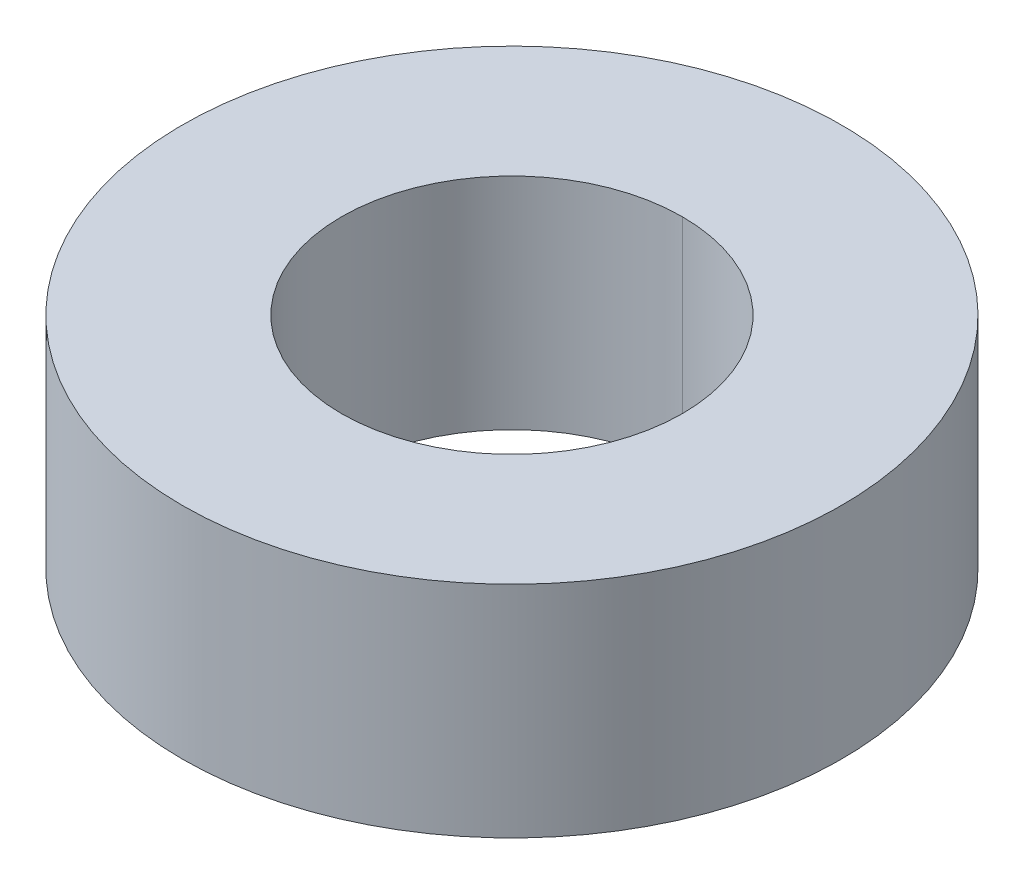
ISO-10303-21;
HEADER;
FILE_DESCRIPTION(('STEP AP214'),'2;1');
FILE_NAME('part.step','',(''),(''),'','','');
FILE_SCHEMA(('AUTOMOTIVE_DESIGN { 1 0 10303 214 1 1 1 1 }'));
ENDSEC;
DATA;
#1=APPLICATION_CONTEXT('core data for automotive mechanical design processes');
#2=APPLICATION_PROTOCOL_DEFINITION('international standard','automotive_design',2000,#1);
#3=PRODUCT_CONTEXT('',#1,'mechanical');
#4=PRODUCT('Part','Part','',(#3));
#5=PRODUCT_RELATED_PRODUCT_CATEGORY('part','',(#4));
#6=PRODUCT_DEFINITION_FORMATION('','',#4);
#7=PRODUCT_DEFINITION_CONTEXT('part definition',#1,'design');
#8=PRODUCT_DEFINITION('design','',#6,#7);
#9=PRODUCT_DEFINITION_SHAPE('','',#8);
#10=(LENGTH_UNIT() NAMED_UNIT(*) SI_UNIT(.MILLI.,.METRE.));
#11=(NAMED_UNIT(*) PLANE_ANGLE_UNIT() SI_UNIT($,.RADIAN.));
#12=(NAMED_UNIT(*) SI_UNIT($,.STERADIAN.) SOLID_ANGLE_UNIT());
#13=UNCERTAINTY_MEASURE_WITH_UNIT(LENGTH_MEASURE(1.E-05),#10,'distance_accuracy_value','');
#14=(GEOMETRIC_REPRESENTATION_CONTEXT(3) GLOBAL_UNCERTAINTY_ASSIGNED_CONTEXT((#13)) GLOBAL_UNIT_ASSIGNED_CONTEXT((#10,
#11,#12)) REPRESENTATION_CONTEXT('',''));
#15=CARTESIAN_POINT('',(0.,0.,0.));
#16=DIRECTION('',(0.,0.,1.));
#17=DIRECTION('',(1.,0.,0.));
#18=AXIS2_PLACEMENT_3D('',#15,#16,#17);
#19=CARTESIAN_POINT('',(0.,1.5875,0.));
#20=DIRECTION('',(0.,1.,0.));
#21=DIRECTION('',(1.,0.,0.));
#22=AXIS2_PLACEMENT_3D('',#19,#20,#21);
#23=PLANE('',#22);
#24=CARTESIAN_POINT('',(0.,1.5875,0.));
#25=DIRECTION('',(0.,1.,0.));
#26=DIRECTION('',(0.,0.,1.));
#27=AXIS2_PLACEMENT_3D('',#24,#25,#26);
#28=CIRCLE('',#27,2.4638);
#29=CARTESIAN_POINT('',(0.,1.5875,-2.4638));
#30=VERTEX_POINT('',#29);
#31=CARTESIAN_POINT('',(0.,1.5875,2.4638));
#32=VERTEX_POINT('',#31);
#33=EDGE_CURVE('E63',#30,#32,#28,.T.);
#34=ORIENTED_EDGE('',*,*,#33,.F.);
#35=CARTESIAN_POINT('',(0.,1.5875,0.));
#36=DIRECTION('',(0.,1.,0.));
#37=DIRECTION('',(0.,0.,1.));
#38=AXIS2_PLACEMENT_3D('',#35,#36,#37);
#39=CIRCLE('',#38,2.4638);
#40=EDGE_CURVE('E83',#32,#30,#39,.T.);
#41=ORIENTED_EDGE('',*,*,#40,.F.);
#42=EDGE_LOOP('',(#34,#41));
#43=FACE_BOUND('',#42,.T.);
#44=CARTESIAN_POINT('',(0.,1.5875,0.));
#45=DIRECTION('',(0.,1.,0.));
#46=DIRECTION('',(0.,0.,1.));
#47=AXIS2_PLACEMENT_3D('',#44,#45,#46);
#48=CIRCLE('',#47,4.7625);
#49=CARTESIAN_POINT('',(0.,1.5875,4.7625));
#50=VERTEX_POINT('',#49);
#51=EDGE_CURVE('E96',#50,#50,#48,.T.);
#52=ORIENTED_EDGE('',*,*,#51,.T.);
#53=EDGE_LOOP('',(#52));
#54=FACE_BOUND('',#53,.T.);
#55=ADVANCED_FACE('F42',(#43,#54),#23,.T.);
#56=CARTESIAN_POINT('',(0.,-1.5875,0.));
#57=DIRECTION('',(0.,1.,0.));
#58=DIRECTION('',(1.,0.,0.));
#59=AXIS2_PLACEMENT_3D('',#56,#57,#58);
#60=PLANE('',#59);
#61=CARTESIAN_POINT('',(0.,-1.5875,0.));
#62=DIRECTION('',(0.,1.,0.));
#63=DIRECTION('',(0.,0.,1.));
#64=AXIS2_PLACEMENT_3D('',#61,#62,#63);
#65=CIRCLE('',#64,2.4638);
#66=CARTESIAN_POINT('',(0.,-1.5875,-2.4638));
#67=VERTEX_POINT('',#66);
#68=CARTESIAN_POINT('',(0.,-1.5875,2.4638));
#69=VERTEX_POINT('',#68);
#70=EDGE_CURVE('E11',#67,#69,#65,.T.);
#71=ORIENTED_EDGE('',*,*,#70,.T.);
#72=CARTESIAN_POINT('',(0.,-1.5875,0.));
#73=DIRECTION('',(0.,1.,0.));
#74=DIRECTION('',(0.,0.,1.));
#75=AXIS2_PLACEMENT_3D('',#72,#73,#74);
#76=CIRCLE('',#75,2.4638);
#77=EDGE_CURVE('E46',#69,#67,#76,.T.);
#78=ORIENTED_EDGE('',*,*,#77,.T.);
#79=EDGE_LOOP('',(#71,#78));
#80=FACE_BOUND('',#79,.T.);
#81=CARTESIAN_POINT('',(0.,-1.5875,0.));
#82=DIRECTION('',(0.,1.,0.));
#83=DIRECTION('',(0.,0.,1.));
#84=AXIS2_PLACEMENT_3D('',#81,#82,#83);
#85=CIRCLE('',#84,4.7625);
#86=CARTESIAN_POINT('',(0.,-1.5875,4.7625));
#87=VERTEX_POINT('',#86);
#88=EDGE_CURVE('E88',#87,#87,#85,.T.);
#89=ORIENTED_EDGE('',*,*,#88,.F.);
#90=EDGE_LOOP('',(#89));
#91=FACE_BOUND('',#90,.T.);
#92=ADVANCED_FACE('F44',(#80,#91),#60,.F.);
#93=CARTESIAN_POINT('',(0.,1.5875,0.));
#94=DIRECTION('',(0.,-1.,0.));
#95=DIRECTION('',(0.,0.,-1.));
#96=AXIS2_PLACEMENT_3D('',#93,#94,#95);
#97=CYLINDRICAL_SURFACE('',#96,2.4638);
#98=DIRECTION('',(0.,-1.,0.));
#99=VECTOR('',#98,1.);
#100=CARTESIAN_POINT('',(0.,1.5875,2.4638));
#101=LINE('',#100,#99);
#102=EDGE_CURVE('E79',#32,#69,#101,.T.);
#103=ORIENTED_EDGE('',*,*,#102,.F.);
#104=ORIENTED_EDGE('',*,*,#40,.T.);
#105=DIRECTION('',(0.,-1.,0.));
#106=VECTOR('',#105,1.);
#107=CARTESIAN_POINT('',(0.,1.5875,-2.4638));
#108=LINE('',#107,#106);
#109=EDGE_CURVE('E81',#30,#67,#108,.T.);
#110=ORIENTED_EDGE('',*,*,#109,.T.);
#111=ORIENTED_EDGE('',*,*,#77,.F.);
#112=EDGE_LOOP('',(#103,#104,#110,#111));
#113=FACE_BOUND('',#112,.T.);
#114=ADVANCED_FACE('F77',(#113),#97,.F.);
#115=CARTESIAN_POINT('',(0.,1.5875,0.));
#116=DIRECTION('',(0.,-1.,0.));
#117=DIRECTION('',(0.,0.,-1.));
#118=AXIS2_PLACEMENT_3D('',#115,#116,#117);
#119=CYLINDRICAL_SURFACE('',#118,2.4638);
#120=ORIENTED_EDGE('',*,*,#33,.T.);
#121=ORIENTED_EDGE('',*,*,#102,.T.);
#122=ORIENTED_EDGE('',*,*,#70,.F.);
#123=ORIENTED_EDGE('',*,*,#109,.F.);
#124=EDGE_LOOP('',(#120,#121,#122,#123));
#125=FACE_BOUND('',#124,.T.);
#126=ADVANCED_FACE('F86',(#125),#119,.F.);
#127=CARTESIAN_POINT('',(0.,-1.5875,0.));
#128=DIRECTION('',(0.,1.,0.));
#129=DIRECTION('',(0.,0.,1.));
#130=AXIS2_PLACEMENT_3D('',#127,#128,#129);
#131=CYLINDRICAL_SURFACE('',#130,4.7625);
#132=ORIENTED_EDGE('',*,*,#88,.T.);
#133=EDGE_LOOP('',(#132));
#134=FACE_BOUND('',#133,.T.);
#135=ORIENTED_EDGE('',*,*,#51,.F.);
#136=EDGE_LOOP('',(#135));
#137=FACE_BOUND('',#136,.T.);
#138=ADVANCED_FACE('F108',(#134,#137),#131,.T.);
#139=CLOSED_SHELL('',(#55,#92,#114,#126,#138));
#140=MANIFOLD_SOLID_BREP('B2',#139);
#141=ADVANCED_BREP_SHAPE_REPRESENTATION('',(#18,#140),#14);
#142=SHAPE_DEFINITION_REPRESENTATION(#9,#141);
ENDSEC;
END-ISO-10303-21;
